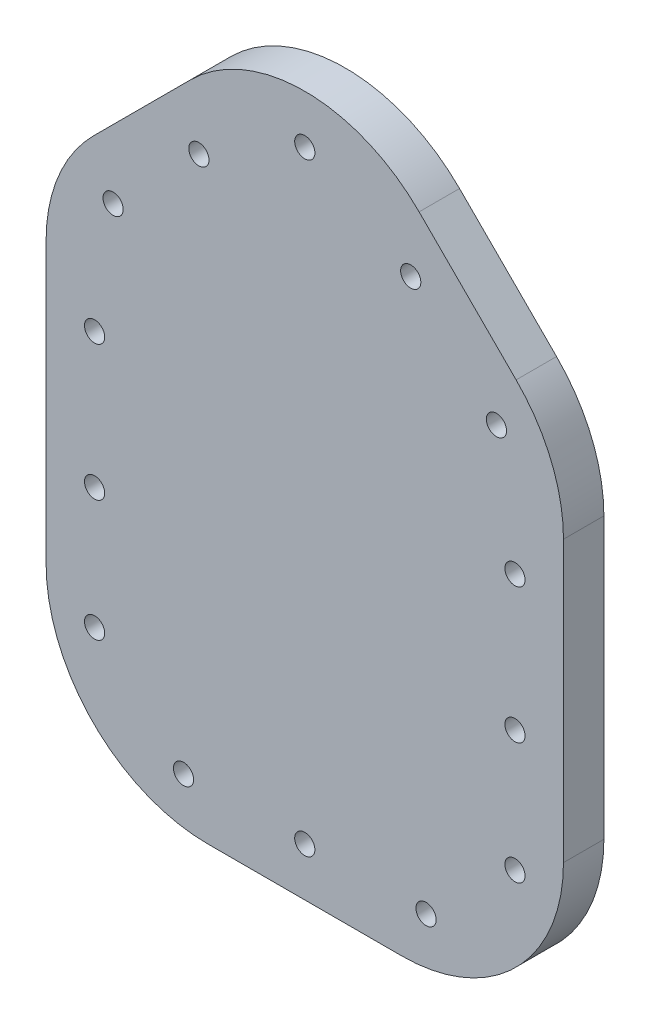
ISO-10303-21;
HEADER;
FILE_DESCRIPTION(('STEP AP214'),'2;1');
FILE_NAME('part.step','',(''),(''),'','','');
FILE_SCHEMA(('AUTOMOTIVE_DESIGN { 1 0 10303 214 1 1 1 1 }'));
ENDSEC;
DATA;
#1=APPLICATION_CONTEXT('core data for automotive mechanical design processes');
#2=APPLICATION_PROTOCOL_DEFINITION('international standard','automotive_design',2000,#1);
#3=PRODUCT_CONTEXT('',#1,'mechanical');
#4=PRODUCT('Part','Part','',(#3));
#5=PRODUCT_RELATED_PRODUCT_CATEGORY('part','',(#4));
#6=PRODUCT_DEFINITION_FORMATION('','',#4);
#7=PRODUCT_DEFINITION_CONTEXT('part definition',#1,'design');
#8=PRODUCT_DEFINITION('design','',#6,#7);
#9=PRODUCT_DEFINITION_SHAPE('','',#8);
#10=(LENGTH_UNIT() NAMED_UNIT(*) SI_UNIT(.MILLI.,.METRE.));
#11=(NAMED_UNIT(*) PLANE_ANGLE_UNIT() SI_UNIT($,.RADIAN.));
#12=(NAMED_UNIT(*) SI_UNIT($,.STERADIAN.) SOLID_ANGLE_UNIT());
#13=UNCERTAINTY_MEASURE_WITH_UNIT(LENGTH_MEASURE(1.E-05),#10,'distance_accuracy_value','');
#14=(GEOMETRIC_REPRESENTATION_CONTEXT(3) GLOBAL_UNCERTAINTY_ASSIGNED_CONTEXT((#13)) GLOBAL_UNIT_ASSIGNED_CONTEXT((#10,
#11,#12)) REPRESENTATION_CONTEXT('',''));
#15=CARTESIAN_POINT('',(0.,0.,0.));
#16=DIRECTION('',(0.,0.,1.));
#17=DIRECTION('',(1.,0.,0.));
#18=AXIS2_PLACEMENT_3D('',#15,#16,#17);
#19=CARTESIAN_POINT('',(-12.,59.6446609406726,5.));
#20=DIRECTION('',(0.,0.,1.));
#21=DIRECTION('',(1.,0.,0.));
#22=AXIS2_PLACEMENT_3D('',#19,#20,#21);
#23=PLANE('',#22);
#24=CARTESIAN_POINT('',(26.,21.1980390271856,5.));
#25=DIRECTION('',(0.,0.,1.));
#26=DIRECTION('',(-1.,0.,0.));
#27=AXIS2_PLACEMENT_3D('',#24,#25,#26);
#28=CIRCLE('',#27,1.25);
#29=CARTESIAN_POINT('',(24.75,21.1980390271856,5.));
#30=VERTEX_POINT('',#29);
#31=EDGE_CURVE('E467',#30,#30,#28,.T.);
#32=ORIENTED_EDGE('',*,*,#31,.F.);
#33=EDGE_LOOP('',(#32));
#34=FACE_BOUND('',#33,.T.);
#35=CARTESIAN_POINT('',(26.,52.9109961313419,5.));
#36=DIRECTION('',(0.,0.,1.));
#37=DIRECTION('',(-1.,0.,0.));
#38=AXIS2_PLACEMENT_3D('',#35,#36,#37);
#39=CIRCLE('',#38,1.25);
#40=CARTESIAN_POINT('',(24.75,52.9109961313419,5.));
#41=VERTEX_POINT('',#40);
#42=EDGE_CURVE('E479',#41,#41,#39,.T.);
#43=ORIENTED_EDGE('',*,*,#42,.F.);
#44=EDGE_LOOP('',(#43));
#45=FACE_BOUND('',#44,.T.);
#46=CARTESIAN_POINT('',(13.1020891710485,78.3415616428474,5.));
#47=DIRECTION('',(0.,0.,1.));
#48=DIRECTION('',(-1.,0.,0.));
#49=AXIS2_PLACEMENT_3D('',#46,#47,#48);
#50=CIRCLE('',#49,1.25000000000011);
#51=CARTESIAN_POINT('',(11.8520891710484,78.3415616428474,5.));
#52=VERTEX_POINT('',#51);
#53=EDGE_CURVE('E491',#52,#52,#50,.T.);
#54=ORIENTED_EDGE('',*,*,#53,.F.);
#55=EDGE_LOOP('',(#54));
#56=FACE_BOUND('',#55,.T.);
#57=CARTESIAN_POINT('',(0.,11.,5.));
#58=DIRECTION('',(0.,0.,1.));
#59=DIRECTION('',(1.,0.,0.));
#60=AXIS2_PLACEMENT_3D('',#57,#58,#59);
#61=CIRCLE('',#60,1.25);
#62=CARTESIAN_POINT('',(1.25000000000001,11.,5.));
#63=VERTEX_POINT('',#62);
#64=EDGE_CURVE('E503',#63,#63,#61,.T.);
#65=ORIENTED_EDGE('',*,*,#64,.F.);
#66=EDGE_LOOP('',(#65));
#67=FACE_BOUND('',#66,.T.);
#68=CARTESIAN_POINT('',(-26.,36.1980390271856,5.));
#69=DIRECTION('',(0.,0.,1.));
#70=DIRECTION('',(1.,0.,0.));
#71=AXIS2_PLACEMENT_3D('',#68,#69,#70);
#72=CIRCLE('',#71,1.25);
#73=CARTESIAN_POINT('',(-24.75,36.1980390271856,5.));
#74=VERTEX_POINT('',#73);
#75=EDGE_CURVE('E515',#74,#74,#72,.T.);
#76=ORIENTED_EDGE('',*,*,#75,.F.);
#77=EDGE_LOOP('',(#76));
#78=FACE_BOUND('',#77,.T.);
#79=CARTESIAN_POINT('',(-23.7086908888467,67.7349599250492,5.));
#80=DIRECTION('',(0.,0.,1.));
#81=DIRECTION('',(1.,0.,0.));
#82=AXIS2_PLACEMENT_3D('',#79,#80,#81);
#83=CIRCLE('',#82,1.25000000000013);
#84=CARTESIAN_POINT('',(-22.4586908888466,67.7349599250492,5.));
#85=VERTEX_POINT('',#84);
#86=EDGE_CURVE('E527',#85,#85,#83,.T.);
#87=ORIENTED_EDGE('',*,*,#86,.F.);
#88=EDGE_LOOP('',(#87));
#89=FACE_BOUND('',#88,.T.);
#90=CARTESIAN_POINT('',(0.,85.6446609406726,5.));
#91=DIRECTION('',(0.,0.,1.));
#92=DIRECTION('',(1.,0.,0.));
#93=AXIS2_PLACEMENT_3D('',#90,#91,#92);
#94=CIRCLE('',#93,1.25);
#95=CARTESIAN_POINT('',(1.25000000000001,85.6446609406726,5.));
#96=VERTEX_POINT('',#95);
#97=EDGE_CURVE('E148',#96,#96,#94,.T.);
#98=ORIENTED_EDGE('',*,*,#97,.F.);
#99=EDGE_LOOP('',(#98));
#100=FACE_BOUND('',#99,.T.);
#101=DIRECTION('',(0.,-1.,0.));
#102=VECTOR('',#101,1.);
#103=CARTESIAN_POINT('',(-32.,5.,5.));
#104=LINE('',#103,#102);
#105=CARTESIAN_POINT('',(-32.,59.6446609406726,5.));
#106=VERTEX_POINT('',#105);
#107=CARTESIAN_POINT('',(-32.,25.,5.));
#108=VERTEX_POINT('',#107);
#109=EDGE_CURVE('E162',#106,#108,#104,.T.);
#110=ORIENTED_EDGE('',*,*,#109,.T.);
#111=CARTESIAN_POINT('',(-12.,25.,5.));
#112=DIRECTION('',(0.,0.,1.));
#113=DIRECTION('',(1.,0.,0.));
#114=AXIS2_PLACEMENT_3D('',#111,#112,#113);
#115=CIRCLE('',#114,20.);
#116=CARTESIAN_POINT('',(-12.,5.,5.));
#117=VERTEX_POINT('',#116);
#118=EDGE_CURVE('E41',#108,#117,#115,.T.);
#119=ORIENTED_EDGE('',*,*,#118,.T.);
#120=DIRECTION('',(1.,0.,0.));
#121=VECTOR('',#120,1.);
#122=CARTESIAN_POINT('',(32.,5.,5.));
#123=LINE('',#122,#121);
#124=CARTESIAN_POINT('',(12.,5.,5.));
#125=VERTEX_POINT('',#124);
#126=EDGE_CURVE('E118',#117,#125,#123,.T.);
#127=ORIENTED_EDGE('',*,*,#126,.T.);
#128=CARTESIAN_POINT('',(12.,25.,5.));
#129=DIRECTION('',(0.,0.,1.));
#130=DIRECTION('',(1.,0.,0.));
#131=AXIS2_PLACEMENT_3D('',#128,#129,#130);
#132=CIRCLE('',#131,20.);
#133=CARTESIAN_POINT('',(32.,25.,5.));
#134=VERTEX_POINT('',#133);
#135=EDGE_CURVE('E48',#125,#134,#132,.T.);
#136=ORIENTED_EDGE('',*,*,#135,.T.);
#137=DIRECTION('',(0.,1.,0.));
#138=VECTOR('',#137,1.);
#139=CARTESIAN_POINT('',(32.,5.,5.));
#140=LINE('',#139,#138);
#141=CARTESIAN_POINT('',(32.,59.6446609406726,5.));
#142=VERTEX_POINT('',#141);
#143=EDGE_CURVE('E110',#134,#142,#140,.T.);
#144=ORIENTED_EDGE('',*,*,#143,.T.);
#145=CARTESIAN_POINT('',(12.,59.6446609406726,5.));
#146=DIRECTION('',(0.,0.,1.));
#147=DIRECTION('',(1.,0.,0.));
#148=AXIS2_PLACEMENT_3D('',#145,#146,#147);
#149=CIRCLE('',#148,20.);
#150=CARTESIAN_POINT('',(26.1421356237309,73.7867965644036,5.));
#151=VERTEX_POINT('',#150);
#152=EDGE_CURVE('E114',#142,#151,#149,.T.);
#153=ORIENTED_EDGE('',*,*,#152,.T.);
#154=DIRECTION('',(-0.707106781186548,0.707106781186547,0.));
#155=VECTOR('',#154,1.);
#156=CARTESIAN_POINT('',(26.1421356237309,73.7867965644036,5.));
#157=LINE('',#156,#155);
#158=CARTESIAN_POINT('',(14.142135623731,85.7867965644034,5.));
#159=VERTEX_POINT('',#158);
#160=EDGE_CURVE('E133',#151,#159,#157,.T.);
#161=ORIENTED_EDGE('',*,*,#160,.T.);
#162=CARTESIAN_POINT('',(0.,71.6446609406726,5.));
#163=DIRECTION('',(0.,0.,1.));
#164=DIRECTION('',(1.,0.,0.));
#165=AXIS2_PLACEMENT_3D('',#162,#163,#164);
#166=CIRCLE('',#165,20.);
#167=CARTESIAN_POINT('',(-14.1421356237309,85.7867965644035,5.));
#168=VERTEX_POINT('',#167);
#169=EDGE_CURVE('E135',#159,#168,#166,.T.);
#170=ORIENTED_EDGE('',*,*,#169,.T.);
#171=DIRECTION('',(-0.707106781186549,-0.707106781186546,0.));
#172=VECTOR('',#171,1.);
#173=CARTESIAN_POINT('',(-26.1421356237309,73.7867965644036,5.));
#174=LINE('',#173,#172);
#175=CARTESIAN_POINT('',(-26.1421356237309,73.7867965644036,5.));
#176=VERTEX_POINT('',#175);
#177=EDGE_CURVE('E140',#168,#176,#174,.T.);
#178=ORIENTED_EDGE('',*,*,#177,.T.);
#179=CARTESIAN_POINT('',(-12.,59.6446609406726,5.));
#180=DIRECTION('',(0.,0.,1.));
#181=DIRECTION('',(1.,0.,0.));
#182=AXIS2_PLACEMENT_3D('',#179,#180,#181);
#183=CIRCLE('',#182,20.);
#184=EDGE_CURVE('E142',#176,#106,#183,.T.);
#185=ORIENTED_EDGE('',*,*,#184,.T.);
#186=EDGE_LOOP('',(#110,#119,#127,#136,#144,#153,#161,#170,#178,#185));
#187=FACE_BOUND('',#186,.T.);
#188=CARTESIAN_POINT('',(-13.1020891710485,78.3415616428474,5.));
#189=DIRECTION('',(0.,0.,1.));
#190=DIRECTION('',(1.,0.,0.));
#191=AXIS2_PLACEMENT_3D('',#188,#189,#190);
#192=CIRCLE('',#191,1.25000000000011);
#193=CARTESIAN_POINT('',(-11.8520891710484,78.3415616428474,5.));
#194=VERTEX_POINT('',#193);
#195=EDGE_CURVE('E533',#194,#194,#192,.T.);
#196=ORIENTED_EDGE('',*,*,#195,.F.);
#197=EDGE_LOOP('',(#196));
#198=FACE_BOUND('',#197,.T.);
#199=CARTESIAN_POINT('',(-26.,52.9109961313419,5.));
#200=DIRECTION('',(0.,0.,1.));
#201=DIRECTION('',(1.,0.,0.));
#202=AXIS2_PLACEMENT_3D('',#199,#200,#201);
#203=CIRCLE('',#202,1.25);
#204=CARTESIAN_POINT('',(-24.75,52.9109961313419,5.));
#205=VERTEX_POINT('',#204);
#206=EDGE_CURVE('E521',#205,#205,#203,.T.);
#207=ORIENTED_EDGE('',*,*,#206,.F.);
#208=EDGE_LOOP('',(#207));
#209=FACE_BOUND('',#208,.T.);
#210=CARTESIAN_POINT('',(-26.,21.1980390271856,5.));
#211=DIRECTION('',(0.,0.,1.));
#212=DIRECTION('',(1.,0.,0.));
#213=AXIS2_PLACEMENT_3D('',#210,#211,#212);
#214=CIRCLE('',#213,1.25);
#215=CARTESIAN_POINT('',(-24.75,21.1980390271856,5.));
#216=VERTEX_POINT('',#215);
#217=EDGE_CURVE('E509',#216,#216,#214,.T.);
#218=ORIENTED_EDGE('',*,*,#217,.F.);
#219=EDGE_LOOP('',(#218));
#220=FACE_BOUND('',#219,.T.);
#221=CARTESIAN_POINT('',(-15.,11.,5.));
#222=DIRECTION('',(0.,0.,1.));
#223=DIRECTION('',(1.,0.,0.));
#224=AXIS2_PLACEMENT_3D('',#221,#222,#223);
#225=CIRCLE('',#224,1.25);
#226=CARTESIAN_POINT('',(-13.75,11.,5.));
#227=VERTEX_POINT('',#226);
#228=EDGE_CURVE('E497',#227,#227,#225,.T.);
#229=ORIENTED_EDGE('',*,*,#228,.F.);
#230=EDGE_LOOP('',(#229));
#231=FACE_BOUND('',#230,.T.);
#232=CARTESIAN_POINT('',(23.7086908888467,67.7349599250492,5.));
#233=DIRECTION('',(0.,0.,1.));
#234=DIRECTION('',(-1.,0.,0.));
#235=AXIS2_PLACEMENT_3D('',#232,#233,#234);
#236=CIRCLE('',#235,1.25000000000013);
#237=CARTESIAN_POINT('',(22.4586908888466,67.7349599250492,5.));
#238=VERTEX_POINT('',#237);
#239=EDGE_CURVE('E485',#238,#238,#236,.T.);
#240=ORIENTED_EDGE('',*,*,#239,.F.);
#241=EDGE_LOOP('',(#240));
#242=FACE_BOUND('',#241,.T.);
#243=CARTESIAN_POINT('',(26.,36.1980390271856,5.));
#244=DIRECTION('',(0.,0.,1.));
#245=DIRECTION('',(-1.,0.,0.));
#246=AXIS2_PLACEMENT_3D('',#243,#244,#245);
#247=CIRCLE('',#246,1.25);
#248=CARTESIAN_POINT('',(24.75,36.1980390271856,5.));
#249=VERTEX_POINT('',#248);
#250=EDGE_CURVE('E473',#249,#249,#247,.T.);
#251=ORIENTED_EDGE('',*,*,#250,.F.);
#252=EDGE_LOOP('',(#251));
#253=FACE_BOUND('',#252,.T.);
#254=CARTESIAN_POINT('',(15.,11.,5.));
#255=DIRECTION('',(0.,0.,1.));
#256=DIRECTION('',(-1.,0.,0.));
#257=AXIS2_PLACEMENT_3D('',#254,#255,#256);
#258=CIRCLE('',#257,1.25);
#259=CARTESIAN_POINT('',(13.75,11.,5.));
#260=VERTEX_POINT('',#259);
#261=EDGE_CURVE('E458',#260,#260,#258,.T.);
#262=ORIENTED_EDGE('',*,*,#261,.F.);
#263=EDGE_LOOP('',(#262));
#264=FACE_BOUND('',#263,.T.);
#265=ADVANCED_FACE('F33',(#34,#45,#56,#67,#78,#89,#100,#187,#198,#209,#220,#231,#242,#253,#264),
#23,.T.);
#266=CARTESIAN_POINT('',(-12.,59.6446609406726,0.));
#267=DIRECTION('',(0.,0.,1.));
#268=DIRECTION('',(1.,0.,0.));
#269=AXIS2_PLACEMENT_3D('',#266,#267,#268);
#270=PLANE('',#269);
#271=DIRECTION('',(1.,0.,0.));
#272=VECTOR('',#271,1.);
#273=CARTESIAN_POINT('',(32.,5.,0.));
#274=LINE('',#273,#272);
#275=CARTESIAN_POINT('',(-12.,5.,0.));
#276=VERTEX_POINT('',#275);
#277=CARTESIAN_POINT('',(12.,5.,0.));
#278=VERTEX_POINT('',#277);
#279=EDGE_CURVE('E147',#276,#278,#274,.T.);
#280=ORIENTED_EDGE('',*,*,#279,.F.);
#281=CARTESIAN_POINT('',(-12.,25.,0.));
#282=DIRECTION('',(0.,0.,1.));
#283=DIRECTION('',(1.,0.,0.));
#284=AXIS2_PLACEMENT_3D('',#281,#282,#283);
#285=CIRCLE('',#284,20.);
#286=CARTESIAN_POINT('',(-32.,25.,0.));
#287=VERTEX_POINT('',#286);
#288=EDGE_CURVE('E181',#276,#287,#285,.F.);
#289=ORIENTED_EDGE('',*,*,#288,.T.);
#290=DIRECTION('',(0.,-1.,0.));
#291=VECTOR('',#290,1.);
#292=CARTESIAN_POINT('',(-32.,5.,0.));
#293=LINE('',#292,#291);
#294=CARTESIAN_POINT('',(-32.,59.6446609406726,0.));
#295=VERTEX_POINT('',#294);
#296=EDGE_CURVE('E145',#295,#287,#293,.T.);
#297=ORIENTED_EDGE('',*,*,#296,.F.);
#298=CARTESIAN_POINT('',(-12.,59.6446609406726,0.));
#299=DIRECTION('',(0.,0.,1.));
#300=DIRECTION('',(1.,0.,0.));
#301=AXIS2_PLACEMENT_3D('',#298,#299,#300);
#302=CIRCLE('',#301,20.);
#303=CARTESIAN_POINT('',(-26.1421356237309,73.7867965644036,0.));
#304=VERTEX_POINT('',#303);
#305=EDGE_CURVE('E160',#304,#295,#302,.T.);
#306=ORIENTED_EDGE('',*,*,#305,.F.);
#307=DIRECTION('',(-0.707106781186549,-0.707106781186546,0.));
#308=VECTOR('',#307,1.);
#309=CARTESIAN_POINT('',(-26.1421356237309,73.7867965644036,0.));
#310=LINE('',#309,#308);
#311=CARTESIAN_POINT('',(-14.1421356237309,85.7867965644035,0.));
#312=VERTEX_POINT('',#311);
#313=EDGE_CURVE('E158',#312,#304,#310,.T.);
#314=ORIENTED_EDGE('',*,*,#313,.F.);
#315=CARTESIAN_POINT('',(0.,71.6446609406726,0.));
#316=DIRECTION('',(0.,0.,1.));
#317=DIRECTION('',(1.,0.,0.));
#318=AXIS2_PLACEMENT_3D('',#315,#316,#317);
#319=CIRCLE('',#318,20.);
#320=CARTESIAN_POINT('',(14.142135623731,85.7867965644034,0.));
#321=VERTEX_POINT('',#320);
#322=EDGE_CURVE('E156',#321,#312,#319,.T.);
#323=ORIENTED_EDGE('',*,*,#322,.F.);
#324=DIRECTION('',(-0.707106781186548,0.707106781186547,0.));
#325=VECTOR('',#324,1.);
#326=CARTESIAN_POINT('',(26.1421356237309,73.7867965644036,0.));
#327=LINE('',#326,#325);
#328=CARTESIAN_POINT('',(26.1421356237309,73.7867965644036,0.));
#329=VERTEX_POINT('',#328);
#330=EDGE_CURVE('E154',#329,#321,#327,.T.);
#331=ORIENTED_EDGE('',*,*,#330,.F.);
#332=CARTESIAN_POINT('',(12.,59.6446609406726,0.));
#333=DIRECTION('',(0.,0.,1.));
#334=DIRECTION('',(1.,0.,0.));
#335=AXIS2_PLACEMENT_3D('',#332,#333,#334);
#336=CIRCLE('',#335,20.);
#337=CARTESIAN_POINT('',(32.,59.6446609406726,0.));
#338=VERTEX_POINT('',#337);
#339=EDGE_CURVE('E152',#338,#329,#336,.T.);
#340=ORIENTED_EDGE('',*,*,#339,.F.);
#341=DIRECTION('',(0.,1.,0.));
#342=VECTOR('',#341,1.);
#343=CARTESIAN_POINT('',(32.,5.,0.));
#344=LINE('',#343,#342);
#345=CARTESIAN_POINT('',(32.,25.,0.));
#346=VERTEX_POINT('',#345);
#347=EDGE_CURVE('E124',#346,#338,#344,.T.);
#348=ORIENTED_EDGE('',*,*,#347,.F.);
#349=CARTESIAN_POINT('',(12.,25.,0.));
#350=DIRECTION('',(0.,0.,1.));
#351=DIRECTION('',(1.,0.,0.));
#352=AXIS2_PLACEMENT_3D('',#349,#350,#351);
#353=CIRCLE('',#352,20.);
#354=EDGE_CURVE('E179',#346,#278,#353,.F.);
#355=ORIENTED_EDGE('',*,*,#354,.T.);
#356=EDGE_LOOP('',(#280,#289,#297,#306,#314,#323,#331,#340,#348,#355));
#357=FACE_BOUND('',#356,.T.);
#358=CARTESIAN_POINT('',(0.,85.6446609406726,0.));
#359=DIRECTION('',(0.,0.,1.));
#360=DIRECTION('',(1.,0.,0.));
#361=AXIS2_PLACEMENT_3D('',#358,#359,#360);
#362=CIRCLE('',#361,1.25);
#363=CARTESIAN_POINT('',(1.25000000000001,85.6446609406726,0.));
#364=VERTEX_POINT('',#363);
#365=EDGE_CURVE('E536',#364,#364,#362,.T.);
#366=ORIENTED_EDGE('',*,*,#365,.T.);
#367=EDGE_LOOP('',(#366));
#368=FACE_BOUND('',#367,.T.);
#369=CARTESIAN_POINT('',(-13.1020891710485,78.3415616428474,0.));
#370=DIRECTION('',(0.,0.,1.));
#371=DIRECTION('',(1.,0.,0.));
#372=AXIS2_PLACEMENT_3D('',#369,#370,#371);
#373=CIRCLE('',#372,1.25000000000011);
#374=CARTESIAN_POINT('',(-11.8520891710484,78.3415616428474,0.));
#375=VERTEX_POINT('',#374);
#376=EDGE_CURVE('E530',#375,#375,#373,.T.);
#377=ORIENTED_EDGE('',*,*,#376,.T.);
#378=EDGE_LOOP('',(#377));
#379=FACE_BOUND('',#378,.T.);
#380=CARTESIAN_POINT('',(-23.7086908888467,67.7349599250492,0.));
#381=DIRECTION('',(0.,0.,1.));
#382=DIRECTION('',(1.,0.,0.));
#383=AXIS2_PLACEMENT_3D('',#380,#381,#382);
#384=CIRCLE('',#383,1.25000000000013);
#385=CARTESIAN_POINT('',(-22.4586908888466,67.7349599250492,0.));
#386=VERTEX_POINT('',#385);
#387=EDGE_CURVE('E524',#386,#386,#384,.T.);
#388=ORIENTED_EDGE('',*,*,#387,.T.);
#389=EDGE_LOOP('',(#388));
#390=FACE_BOUND('',#389,.T.);
#391=CARTESIAN_POINT('',(-26.,52.9109961313419,0.));
#392=DIRECTION('',(0.,0.,1.));
#393=DIRECTION('',(1.,0.,0.));
#394=AXIS2_PLACEMENT_3D('',#391,#392,#393);
#395=CIRCLE('',#394,1.25);
#396=CARTESIAN_POINT('',(-24.75,52.9109961313419,0.));
#397=VERTEX_POINT('',#396);
#398=EDGE_CURVE('E518',#397,#397,#395,.T.);
#399=ORIENTED_EDGE('',*,*,#398,.T.);
#400=EDGE_LOOP('',(#399));
#401=FACE_BOUND('',#400,.T.);
#402=CARTESIAN_POINT('',(-26.,36.1980390271856,0.));
#403=DIRECTION('',(0.,0.,1.));
#404=DIRECTION('',(1.,0.,0.));
#405=AXIS2_PLACEMENT_3D('',#402,#403,#404);
#406=CIRCLE('',#405,1.25);
#407=CARTESIAN_POINT('',(-24.75,36.1980390271856,0.));
#408=VERTEX_POINT('',#407);
#409=EDGE_CURVE('E512',#408,#408,#406,.T.);
#410=ORIENTED_EDGE('',*,*,#409,.T.);
#411=EDGE_LOOP('',(#410));
#412=FACE_BOUND('',#411,.T.);
#413=CARTESIAN_POINT('',(-26.,21.1980390271856,0.));
#414=DIRECTION('',(0.,0.,1.));
#415=DIRECTION('',(1.,0.,0.));
#416=AXIS2_PLACEMENT_3D('',#413,#414,#415);
#417=CIRCLE('',#416,1.25);
#418=CARTESIAN_POINT('',(-24.75,21.1980390271856,0.));
#419=VERTEX_POINT('',#418);
#420=EDGE_CURVE('E506',#419,#419,#417,.T.);
#421=ORIENTED_EDGE('',*,*,#420,.T.);
#422=EDGE_LOOP('',(#421));
#423=FACE_BOUND('',#422,.T.);
#424=CARTESIAN_POINT('',(0.,11.,0.));
#425=DIRECTION('',(0.,0.,1.));
#426=DIRECTION('',(1.,0.,0.));
#427=AXIS2_PLACEMENT_3D('',#424,#425,#426);
#428=CIRCLE('',#427,1.25);
#429=CARTESIAN_POINT('',(1.25000000000001,11.,0.));
#430=VERTEX_POINT('',#429);
#431=EDGE_CURVE('E500',#430,#430,#428,.T.);
#432=ORIENTED_EDGE('',*,*,#431,.T.);
#433=EDGE_LOOP('',(#432));
#434=FACE_BOUND('',#433,.T.);
#435=CARTESIAN_POINT('',(-15.,11.,0.));
#436=DIRECTION('',(0.,0.,1.));
#437=DIRECTION('',(1.,0.,0.));
#438=AXIS2_PLACEMENT_3D('',#435,#436,#437);
#439=CIRCLE('',#438,1.25);
#440=CARTESIAN_POINT('',(-13.75,11.,0.));
#441=VERTEX_POINT('',#440);
#442=EDGE_CURVE('E494',#441,#441,#439,.T.);
#443=ORIENTED_EDGE('',*,*,#442,.T.);
#444=EDGE_LOOP('',(#443));
#445=FACE_BOUND('',#444,.T.);
#446=CARTESIAN_POINT('',(13.1020891710485,78.3415616428474,0.));
#447=DIRECTION('',(0.,0.,1.));
#448=DIRECTION('',(-1.,0.,0.));
#449=AXIS2_PLACEMENT_3D('',#446,#447,#448);
#450=CIRCLE('',#449,1.25000000000011);
#451=CARTESIAN_POINT('',(11.8520891710484,78.3415616428474,0.));
#452=VERTEX_POINT('',#451);
#453=EDGE_CURVE('E488',#452,#452,#450,.T.);
#454=ORIENTED_EDGE('',*,*,#453,.T.);
#455=EDGE_LOOP('',(#454));
#456=FACE_BOUND('',#455,.T.);
#457=CARTESIAN_POINT('',(23.7086908888467,67.7349599250492,0.));
#458=DIRECTION('',(0.,0.,1.));
#459=DIRECTION('',(-1.,0.,0.));
#460=AXIS2_PLACEMENT_3D('',#457,#458,#459);
#461=CIRCLE('',#460,1.25000000000013);
#462=CARTESIAN_POINT('',(22.4586908888466,67.7349599250492,0.));
#463=VERTEX_POINT('',#462);
#464=EDGE_CURVE('E482',#463,#463,#461,.T.);
#465=ORIENTED_EDGE('',*,*,#464,.T.);
#466=EDGE_LOOP('',(#465));
#467=FACE_BOUND('',#466,.T.);
#468=CARTESIAN_POINT('',(26.,52.9109961313419,0.));
#469=DIRECTION('',(0.,0.,1.));
#470=DIRECTION('',(-1.,0.,0.));
#471=AXIS2_PLACEMENT_3D('',#468,#469,#470);
#472=CIRCLE('',#471,1.25);
#473=CARTESIAN_POINT('',(24.75,52.9109961313419,0.));
#474=VERTEX_POINT('',#473);
#475=EDGE_CURVE('E476',#474,#474,#472,.T.);
#476=ORIENTED_EDGE('',*,*,#475,.T.);
#477=EDGE_LOOP('',(#476));
#478=FACE_BOUND('',#477,.T.);
#479=CARTESIAN_POINT('',(26.,36.1980390271856,0.));
#480=DIRECTION('',(0.,0.,1.));
#481=DIRECTION('',(-1.,0.,0.));
#482=AXIS2_PLACEMENT_3D('',#479,#480,#481);
#483=CIRCLE('',#482,1.25);
#484=CARTESIAN_POINT('',(24.75,36.1980390271856,0.));
#485=VERTEX_POINT('',#484);
#486=EDGE_CURVE('E470',#485,#485,#483,.T.);
#487=ORIENTED_EDGE('',*,*,#486,.T.);
#488=EDGE_LOOP('',(#487));
#489=FACE_BOUND('',#488,.T.);
#490=CARTESIAN_POINT('',(26.,21.1980390271856,0.));
#491=DIRECTION('',(0.,0.,1.));
#492=DIRECTION('',(-1.,0.,0.));
#493=AXIS2_PLACEMENT_3D('',#490,#491,#492);
#494=CIRCLE('',#493,1.25);
#495=CARTESIAN_POINT('',(24.75,21.1980390271856,0.));
#496=VERTEX_POINT('',#495);
#497=EDGE_CURVE('E464',#496,#496,#494,.T.);
#498=ORIENTED_EDGE('',*,*,#497,.T.);
#499=EDGE_LOOP('',(#498));
#500=FACE_BOUND('',#499,.T.);
#501=CARTESIAN_POINT('',(15.,11.,0.));
#502=DIRECTION('',(0.,0.,1.));
#503=DIRECTION('',(-1.,0.,0.));
#504=AXIS2_PLACEMENT_3D('',#501,#502,#503);
#505=CIRCLE('',#504,1.25);
#506=CARTESIAN_POINT('',(13.75,11.,0.));
#507=VERTEX_POINT('',#506);
#508=EDGE_CURVE('E461',#507,#507,#505,.T.);
#509=ORIENTED_EDGE('',*,*,#508,.T.);
#510=EDGE_LOOP('',(#509));
#511=FACE_BOUND('',#510,.T.);
#512=ADVANCED_FACE('F195',(#357,#368,#379,#390,#401,#412,#423,#434,#445,#456,#467,#478,#489,
#500,#511),#270,.F.);
#513=CARTESIAN_POINT('',(-32.,5.,5.));
#514=DIRECTION('',(1.,0.,0.));
#515=DIRECTION('',(0.,1.,0.));
#516=AXIS2_PLACEMENT_3D('',#513,#514,#515);
#517=PLANE('',#516);
#518=ORIENTED_EDGE('',*,*,#296,.T.);
#519=DIRECTION('',(0.,0.,-1.));
#520=VECTOR('',#519,1.);
#521=CARTESIAN_POINT('',(-32.,25.,5.));
#522=LINE('',#521,#520);
#523=EDGE_CURVE('E56',#287,#108,#522,.F.);
#524=ORIENTED_EDGE('',*,*,#523,.T.);
#525=ORIENTED_EDGE('',*,*,#109,.F.);
#526=DIRECTION('',(0.,0.,-1.));
#527=VECTOR('',#526,1.);
#528=CARTESIAN_POINT('',(-32.,59.6446609406726,5.));
#529=LINE('',#528,#527);
#530=EDGE_CURVE('E144',#106,#295,#529,.T.);
#531=ORIENTED_EDGE('',*,*,#530,.T.);
#532=EDGE_LOOP('',(#518,#524,#525,#531));
#533=FACE_BOUND('',#532,.T.);
#534=ADVANCED_FACE('F198',(#533),#517,.F.);
#535=CARTESIAN_POINT('',(32.,5.,5.));
#536=DIRECTION('',(0.,1.,0.));
#537=DIRECTION('',(0.,0.,1.));
#538=AXIS2_PLACEMENT_3D('',#535,#536,#537);
#539=PLANE('',#538);
#540=ORIENTED_EDGE('',*,*,#126,.F.);
#541=DIRECTION('',(0.,0.,-1.));
#542=VECTOR('',#541,1.);
#543=CARTESIAN_POINT('',(-12.,5.,5.));
#544=LINE('',#543,#542);
#545=EDGE_CURVE('E176',#117,#276,#544,.T.);
#546=ORIENTED_EDGE('',*,*,#545,.T.);
#547=ORIENTED_EDGE('',*,*,#279,.T.);
#548=DIRECTION('',(0.,0.,-1.));
#549=VECTOR('',#548,1.);
#550=CARTESIAN_POINT('',(12.,5.,5.));
#551=LINE('',#550,#549);
#552=EDGE_CURVE('E127',#278,#125,#551,.F.);
#553=ORIENTED_EDGE('',*,*,#552,.T.);
#554=EDGE_LOOP('',(#540,#546,#547,#553));
#555=FACE_BOUND('',#554,.T.);
#556=ADVANCED_FACE('F189',(#555),#539,.F.);
#557=CARTESIAN_POINT('',(32.,5.,5.));
#558=DIRECTION('',(-1.,0.,0.));
#559=DIRECTION('',(0.,-1.,0.));
#560=AXIS2_PLACEMENT_3D('',#557,#558,#559);
#561=PLANE('',#560);
#562=ORIENTED_EDGE('',*,*,#143,.F.);
#563=DIRECTION('',(0.,0.,-1.));
#564=VECTOR('',#563,1.);
#565=CARTESIAN_POINT('',(32.,25.,5.));
#566=LINE('',#565,#564);
#567=EDGE_CURVE('E11',#134,#346,#566,.T.);
#568=ORIENTED_EDGE('',*,*,#567,.T.);
#569=ORIENTED_EDGE('',*,*,#347,.T.);
#570=DIRECTION('',(0.,0.,-1.));
#571=VECTOR('',#570,1.);
#572=CARTESIAN_POINT('',(32.,59.6446609406726,5.));
#573=LINE('',#572,#571);
#574=EDGE_CURVE('E121',#142,#338,#573,.T.);
#575=ORIENTED_EDGE('',*,*,#574,.F.);
#576=EDGE_LOOP('',(#562,#568,#569,#575));
#577=FACE_BOUND('',#576,.T.);
#578=ADVANCED_FACE('F122',(#577),#561,.F.);
#579=CARTESIAN_POINT('',(12.,59.6446609406726,5.));
#580=DIRECTION('',(0.,0.,-1.));
#581=DIRECTION('',(-1.,0.,0.));
#582=AXIS2_PLACEMENT_3D('',#579,#580,#581);
#583=CYLINDRICAL_SURFACE('',#582,20.);
#584=ORIENTED_EDGE('',*,*,#339,.T.);
#585=DIRECTION('',(0.,0.,-1.));
#586=VECTOR('',#585,1.);
#587=CARTESIAN_POINT('',(26.1421356237309,73.7867965644036,5.));
#588=LINE('',#587,#586);
#589=EDGE_CURVE('E128',#151,#329,#588,.T.);
#590=ORIENTED_EDGE('',*,*,#589,.F.);
#591=ORIENTED_EDGE('',*,*,#152,.F.);
#592=ORIENTED_EDGE('',*,*,#574,.T.);
#593=EDGE_LOOP('',(#584,#590,#591,#592));
#594=FACE_BOUND('',#593,.T.);
#595=ADVANCED_FACE('F130',(#594),#583,.T.);
#596=CARTESIAN_POINT('',(26.1421356237309,73.7867965644036,5.));
#597=DIRECTION('',(-0.707106781186547,-0.707106781186548,0.));
#598=DIRECTION('',(0.707106781186548,-0.707106781186547,0.));
#599=AXIS2_PLACEMENT_3D('',#596,#597,#598);
#600=PLANE('',#599);
#601=ORIENTED_EDGE('',*,*,#330,.T.);
#602=DIRECTION('',(0.,0.,-1.));
#603=VECTOR('',#602,1.);
#604=CARTESIAN_POINT('',(14.142135623731,85.7867965644034,5.));
#605=LINE('',#604,#603);
#606=EDGE_CURVE('E171',#159,#321,#605,.T.);
#607=ORIENTED_EDGE('',*,*,#606,.F.);
#608=ORIENTED_EDGE('',*,*,#160,.F.);
#609=ORIENTED_EDGE('',*,*,#589,.T.);
#610=EDGE_LOOP('',(#601,#607,#608,#609));
#611=FACE_BOUND('',#610,.T.);
#612=ADVANCED_FACE('F216',(#611),#600,.F.);
#613=CARTESIAN_POINT('',(0.,71.6446609406726,5.));
#614=DIRECTION('',(0.,0.,-1.));
#615=DIRECTION('',(-1.,0.,0.));
#616=AXIS2_PLACEMENT_3D('',#613,#614,#615);
#617=CYLINDRICAL_SURFACE('',#616,20.);
#618=ORIENTED_EDGE('',*,*,#322,.T.);
#619=DIRECTION('',(0.,0.,-1.));
#620=VECTOR('',#619,1.);
#621=CARTESIAN_POINT('',(-14.1421356237309,85.7867965644035,5.));
#622=LINE('',#621,#620);
#623=EDGE_CURVE('E168',#168,#312,#622,.T.);
#624=ORIENTED_EDGE('',*,*,#623,.F.);
#625=ORIENTED_EDGE('',*,*,#169,.F.);
#626=ORIENTED_EDGE('',*,*,#606,.T.);
#627=EDGE_LOOP('',(#618,#624,#625,#626));
#628=FACE_BOUND('',#627,.T.);
#629=ADVANCED_FACE('F213',(#628),#617,.T.);
#630=CARTESIAN_POINT('',(-26.1421356237309,73.7867965644036,5.));
#631=DIRECTION('',(0.707106781186546,-0.707106781186549,0.));
#632=DIRECTION('',(0.707106781186549,0.707106781186546,0.));
#633=AXIS2_PLACEMENT_3D('',#630,#631,#632);
#634=PLANE('',#633);
#635=ORIENTED_EDGE('',*,*,#313,.T.);
#636=DIRECTION('',(0.,0.,-1.));
#637=VECTOR('',#636,1.);
#638=CARTESIAN_POINT('',(-26.1421356237309,73.7867965644036,5.));
#639=LINE('',#638,#637);
#640=EDGE_CURVE('E165',#176,#304,#639,.T.);
#641=ORIENTED_EDGE('',*,*,#640,.F.);
#642=ORIENTED_EDGE('',*,*,#177,.F.);
#643=ORIENTED_EDGE('',*,*,#623,.T.);
#644=EDGE_LOOP('',(#635,#641,#642,#643));
#645=FACE_BOUND('',#644,.T.);
#646=ADVANCED_FACE('F208',(#645),#634,.F.);
#647=CARTESIAN_POINT('',(-12.,59.6446609406726,5.));
#648=DIRECTION('',(0.,0.,-1.));
#649=DIRECTION('',(-1.,0.,0.));
#650=AXIS2_PLACEMENT_3D('',#647,#648,#649);
#651=CYLINDRICAL_SURFACE('',#650,20.);
#652=ORIENTED_EDGE('',*,*,#305,.T.);
#653=ORIENTED_EDGE('',*,*,#530,.F.);
#654=ORIENTED_EDGE('',*,*,#184,.F.);
#655=ORIENTED_EDGE('',*,*,#640,.T.);
#656=EDGE_LOOP('',(#652,#653,#654,#655));
#657=FACE_BOUND('',#656,.T.);
#658=ADVANCED_FACE('F202',(#657),#651,.T.);
#659=CARTESIAN_POINT('',(0.,85.6446609406726,5.));
#660=DIRECTION('',(0.,0.,-1.));
#661=DIRECTION('',(-1.,0.,0.));
#662=AXIS2_PLACEMENT_3D('',#659,#660,#661);
#663=CYLINDRICAL_SURFACE('',#662,1.25);
#664=ORIENTED_EDGE('',*,*,#97,.T.);
#665=EDGE_LOOP('',(#664));
#666=FACE_BOUND('',#665,.T.);
#667=ORIENTED_EDGE('',*,*,#365,.F.);
#668=EDGE_LOOP('',(#667));
#669=FACE_BOUND('',#668,.T.);
#670=ADVANCED_FACE('F233',(#666,#669),#663,.F.);
#671=CARTESIAN_POINT('',(-13.1020891710485,78.3415616428474,5.));
#672=DIRECTION('',(0.,0.,-1.));
#673=DIRECTION('',(-1.,0.,0.));
#674=AXIS2_PLACEMENT_3D('',#671,#672,#673);
#675=CYLINDRICAL_SURFACE('',#674,1.25000000000011);
#676=ORIENTED_EDGE('',*,*,#195,.T.);
#677=EDGE_LOOP('',(#676));
#678=FACE_BOUND('',#677,.T.);
#679=ORIENTED_EDGE('',*,*,#376,.F.);
#680=EDGE_LOOP('',(#679));
#681=FACE_BOUND('',#680,.T.);
#682=ADVANCED_FACE('F290',(#678,#681),#675,.F.);
#683=CARTESIAN_POINT('',(-23.7086908888467,67.7349599250492,5.));
#684=DIRECTION('',(0.,0.,-1.));
#685=DIRECTION('',(-1.,0.,0.));
#686=AXIS2_PLACEMENT_3D('',#683,#684,#685);
#687=CYLINDRICAL_SURFACE('',#686,1.25000000000013);
#688=ORIENTED_EDGE('',*,*,#86,.T.);
#689=EDGE_LOOP('',(#688));
#690=FACE_BOUND('',#689,.T.);
#691=ORIENTED_EDGE('',*,*,#387,.F.);
#692=EDGE_LOOP('',(#691));
#693=FACE_BOUND('',#692,.T.);
#694=ADVANCED_FACE('F297',(#690,#693),#687,.F.);
#695=CARTESIAN_POINT('',(-26.,52.9109961313419,5.));
#696=DIRECTION('',(0.,0.,-1.));
#697=DIRECTION('',(-1.,0.,0.));
#698=AXIS2_PLACEMENT_3D('',#695,#696,#697);
#699=CYLINDRICAL_SURFACE('',#698,1.25);
#700=ORIENTED_EDGE('',*,*,#206,.T.);
#701=EDGE_LOOP('',(#700));
#702=FACE_BOUND('',#701,.T.);
#703=ORIENTED_EDGE('',*,*,#398,.F.);
#704=EDGE_LOOP('',(#703));
#705=FACE_BOUND('',#704,.T.);
#706=ADVANCED_FACE('F304',(#702,#705),#699,.F.);
#707=CARTESIAN_POINT('',(-26.,36.1980390271856,5.));
#708=DIRECTION('',(0.,0.,-1.));
#709=DIRECTION('',(-1.,0.,0.));
#710=AXIS2_PLACEMENT_3D('',#707,#708,#709);
#711=CYLINDRICAL_SURFACE('',#710,1.25);
#712=ORIENTED_EDGE('',*,*,#75,.T.);
#713=EDGE_LOOP('',(#712));
#714=FACE_BOUND('',#713,.T.);
#715=ORIENTED_EDGE('',*,*,#409,.F.);
#716=EDGE_LOOP('',(#715));
#717=FACE_BOUND('',#716,.T.);
#718=ADVANCED_FACE('F312',(#714,#717),#711,.F.);
#719=CARTESIAN_POINT('',(-26.,21.1980390271856,5.));
#720=DIRECTION('',(0.,0.,-1.));
#721=DIRECTION('',(-1.,0.,0.));
#722=AXIS2_PLACEMENT_3D('',#719,#720,#721);
#723=CYLINDRICAL_SURFACE('',#722,1.25);
#724=ORIENTED_EDGE('',*,*,#217,.T.);
#725=EDGE_LOOP('',(#724));
#726=FACE_BOUND('',#725,.T.);
#727=ORIENTED_EDGE('',*,*,#420,.F.);
#728=EDGE_LOOP('',(#727));
#729=FACE_BOUND('',#728,.T.);
#730=ADVANCED_FACE('F320',(#726,#729),#723,.F.);
#731=CARTESIAN_POINT('',(0.,11.,5.));
#732=DIRECTION('',(0.,0.,-1.));
#733=DIRECTION('',(-1.,0.,0.));
#734=AXIS2_PLACEMENT_3D('',#731,#732,#733);
#735=CYLINDRICAL_SURFACE('',#734,1.25);
#736=ORIENTED_EDGE('',*,*,#64,.T.);
#737=EDGE_LOOP('',(#736));
#738=FACE_BOUND('',#737,.T.);
#739=ORIENTED_EDGE('',*,*,#431,.F.);
#740=EDGE_LOOP('',(#739));
#741=FACE_BOUND('',#740,.T.);
#742=ADVANCED_FACE('F328',(#738,#741),#735,.F.);
#743=CARTESIAN_POINT('',(-15.,11.,5.));
#744=DIRECTION('',(0.,0.,-1.));
#745=DIRECTION('',(-1.,0.,0.));
#746=AXIS2_PLACEMENT_3D('',#743,#744,#745);
#747=CYLINDRICAL_SURFACE('',#746,1.25);
#748=ORIENTED_EDGE('',*,*,#228,.T.);
#749=EDGE_LOOP('',(#748));
#750=FACE_BOUND('',#749,.T.);
#751=ORIENTED_EDGE('',*,*,#442,.F.);
#752=EDGE_LOOP('',(#751));
#753=FACE_BOUND('',#752,.T.);
#754=ADVANCED_FACE('F336',(#750,#753),#747,.F.);
#755=CARTESIAN_POINT('',(13.1020891710485,78.3415616428474,5.));
#756=DIRECTION('',(0.,0.,-1.));
#757=DIRECTION('',(-1.,0.,0.));
#758=AXIS2_PLACEMENT_3D('',#755,#756,#757);
#759=CYLINDRICAL_SURFACE('',#758,1.25000000000011);
#760=ORIENTED_EDGE('',*,*,#53,.T.);
#761=EDGE_LOOP('',(#760));
#762=FACE_BOUND('',#761,.T.);
#763=ORIENTED_EDGE('',*,*,#453,.F.);
#764=EDGE_LOOP('',(#763));
#765=FACE_BOUND('',#764,.T.);
#766=ADVANCED_FACE('F344',(#762,#765),#759,.F.);
#767=CARTESIAN_POINT('',(23.7086908888467,67.7349599250492,5.));
#768=DIRECTION('',(0.,0.,-1.));
#769=DIRECTION('',(-1.,0.,0.));
#770=AXIS2_PLACEMENT_3D('',#767,#768,#769);
#771=CYLINDRICAL_SURFACE('',#770,1.25000000000013);
#772=ORIENTED_EDGE('',*,*,#239,.T.);
#773=EDGE_LOOP('',(#772));
#774=FACE_BOUND('',#773,.T.);
#775=ORIENTED_EDGE('',*,*,#464,.F.);
#776=EDGE_LOOP('',(#775));
#777=FACE_BOUND('',#776,.T.);
#778=ADVANCED_FACE('F352',(#774,#777),#771,.F.);
#779=CARTESIAN_POINT('',(26.,52.9109961313419,5.));
#780=DIRECTION('',(0.,0.,-1.));
#781=DIRECTION('',(-1.,0.,0.));
#782=AXIS2_PLACEMENT_3D('',#779,#780,#781);
#783=CYLINDRICAL_SURFACE('',#782,1.25);
#784=ORIENTED_EDGE('',*,*,#42,.T.);
#785=EDGE_LOOP('',(#784));
#786=FACE_BOUND('',#785,.T.);
#787=ORIENTED_EDGE('',*,*,#475,.F.);
#788=EDGE_LOOP('',(#787));
#789=FACE_BOUND('',#788,.T.);
#790=ADVANCED_FACE('F360',(#786,#789),#783,.F.);
#791=CARTESIAN_POINT('',(26.,36.1980390271856,5.));
#792=DIRECTION('',(0.,0.,-1.));
#793=DIRECTION('',(-1.,0.,0.));
#794=AXIS2_PLACEMENT_3D('',#791,#792,#793);
#795=CYLINDRICAL_SURFACE('',#794,1.25);
#796=ORIENTED_EDGE('',*,*,#250,.T.);
#797=EDGE_LOOP('',(#796));
#798=FACE_BOUND('',#797,.T.);
#799=ORIENTED_EDGE('',*,*,#486,.F.);
#800=EDGE_LOOP('',(#799));
#801=FACE_BOUND('',#800,.T.);
#802=ADVANCED_FACE('F368',(#798,#801),#795,.F.);
#803=CARTESIAN_POINT('',(26.,21.1980390271856,5.));
#804=DIRECTION('',(0.,0.,-1.));
#805=DIRECTION('',(-1.,0.,0.));
#806=AXIS2_PLACEMENT_3D('',#803,#804,#805);
#807=CYLINDRICAL_SURFACE('',#806,1.25);
#808=ORIENTED_EDGE('',*,*,#31,.T.);
#809=EDGE_LOOP('',(#808));
#810=FACE_BOUND('',#809,.T.);
#811=ORIENTED_EDGE('',*,*,#497,.F.);
#812=EDGE_LOOP('',(#811));
#813=FACE_BOUND('',#812,.T.);
#814=ADVANCED_FACE('F376',(#810,#813),#807,.F.);
#815=CARTESIAN_POINT('',(15.,11.,5.));
#816=DIRECTION('',(0.,0.,-1.));
#817=DIRECTION('',(-1.,0.,0.));
#818=AXIS2_PLACEMENT_3D('',#815,#816,#817);
#819=CYLINDRICAL_SURFACE('',#818,1.25);
#820=ORIENTED_EDGE('',*,*,#261,.T.);
#821=EDGE_LOOP('',(#820));
#822=FACE_BOUND('',#821,.T.);
#823=ORIENTED_EDGE('',*,*,#508,.F.);
#824=EDGE_LOOP('',(#823));
#825=FACE_BOUND('',#824,.T.);
#826=ADVANCED_FACE('F222',(#822,#825),#819,.F.);
#827=CARTESIAN_POINT('',(-12.,25.,5.));
#828=DIRECTION('',(0.,0.,-1.));
#829=DIRECTION('',(-1.,0.,0.));
#830=AXIS2_PLACEMENT_3D('',#827,#828,#829);
#831=CYLINDRICAL_SURFACE('',#830,20.);
#832=ORIENTED_EDGE('',*,*,#118,.F.);
#833=ORIENTED_EDGE('',*,*,#523,.F.);
#834=ORIENTED_EDGE('',*,*,#288,.F.);
#835=ORIENTED_EDGE('',*,*,#545,.F.);
#836=EDGE_LOOP('',(#832,#833,#834,#835));
#837=FACE_BOUND('',#836,.T.);
#838=ADVANCED_FACE('F192',(#837),#831,.T.);
#839=CARTESIAN_POINT('',(12.,25.,5.));
#840=DIRECTION('',(0.,0.,-1.));
#841=DIRECTION('',(-1.,0.,0.));
#842=AXIS2_PLACEMENT_3D('',#839,#840,#841);
#843=CYLINDRICAL_SURFACE('',#842,20.);
#844=ORIENTED_EDGE('',*,*,#135,.F.);
#845=ORIENTED_EDGE('',*,*,#552,.F.);
#846=ORIENTED_EDGE('',*,*,#354,.F.);
#847=ORIENTED_EDGE('',*,*,#567,.F.);
#848=EDGE_LOOP('',(#844,#845,#846,#847));
#849=FACE_BOUND('',#848,.T.);
#850=ADVANCED_FACE('F35',(#849),#843,.T.);
#851=CLOSED_SHELL('',(#265,#512,#534,#556,#578,#595,#612,#629,#646,#658,#670,#682,#694,#706,
#718,#730,#742,#754,#766,#778,#790,#802,#814,#826,#838,#850));
#852=MANIFOLD_SOLID_BREP('B2',#851);
#853=ADVANCED_BREP_SHAPE_REPRESENTATION('',(#18,#852),#14);
#854=SHAPE_DEFINITION_REPRESENTATION(#9,#853);
ENDSEC;
END-ISO-10303-21;
